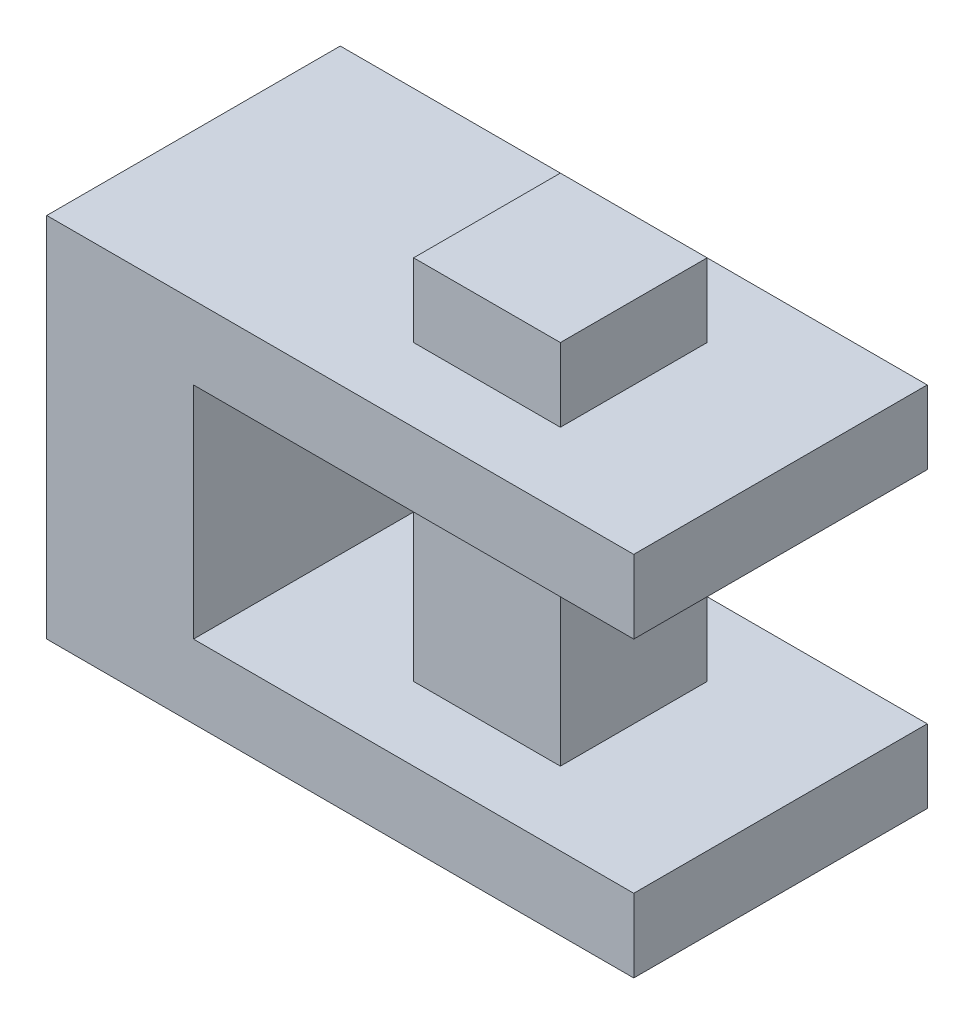
ISO-10303-21;
HEADER;
FILE_DESCRIPTION(('STEP AP214'),'2;1');
FILE_NAME('part.step','',(''),(''),'','','');
FILE_SCHEMA(('AUTOMOTIVE_DESIGN { 1 0 10303 214 1 1 1 1 }'));
ENDSEC;
DATA;
#1=APPLICATION_CONTEXT('core data for automotive mechanical design processes');
#2=APPLICATION_PROTOCOL_DEFINITION('international standard','automotive_design',2000,#1);
#3=PRODUCT_CONTEXT('',#1,'mechanical');
#4=PRODUCT('Part','Part','',(#3));
#5=PRODUCT_RELATED_PRODUCT_CATEGORY('part','',(#4));
#6=PRODUCT_DEFINITION_FORMATION('','',#4);
#7=PRODUCT_DEFINITION_CONTEXT('part definition',#1,'design');
#8=PRODUCT_DEFINITION('design','',#6,#7);
#9=PRODUCT_DEFINITION_SHAPE('','',#8);
#10=(LENGTH_UNIT() NAMED_UNIT(*) SI_UNIT(.MILLI.,.METRE.));
#11=(NAMED_UNIT(*) PLANE_ANGLE_UNIT() SI_UNIT($,.RADIAN.));
#12=(NAMED_UNIT(*) SI_UNIT($,.STERADIAN.) SOLID_ANGLE_UNIT());
#13=UNCERTAINTY_MEASURE_WITH_UNIT(LENGTH_MEASURE(1.E-05),#10,'distance_accuracy_value','');
#14=(GEOMETRIC_REPRESENTATION_CONTEXT(3) GLOBAL_UNCERTAINTY_ASSIGNED_CONTEXT((#13)) GLOBAL_UNIT_ASSIGNED_CONTEXT((#10,
#11,#12)) REPRESENTATION_CONTEXT('',''));
#15=CARTESIAN_POINT('',(0.,0.,0.));
#16=DIRECTION('',(0.,0.,1.));
#17=DIRECTION('',(1.,0.,0.));
#18=AXIS2_PLACEMENT_3D('',#15,#16,#17);
#19=CARTESIAN_POINT('',(0.,25.,20.));
#20=DIRECTION('',(1.,0.,0.));
#21=DIRECTION('',(0.,0.,-1.));
#22=AXIS2_PLACEMENT_3D('',#19,#20,#21);
#23=PLANE('',#22);
#24=DIRECTION('',(0.,-1.,0.));
#25=VECTOR('',#24,1.);
#26=CARTESIAN_POINT('',(0.,25.,0.));
#27=LINE('',#26,#25);
#28=CARTESIAN_POINT('',(0.,25.,0.));
#29=VERTEX_POINT('',#28);
#30=CARTESIAN_POINT('',(0.,0.,0.));
#31=VERTEX_POINT('',#30);
#32=EDGE_CURVE('E204',#29,#31,#27,.T.);
#33=ORIENTED_EDGE('',*,*,#32,.T.);
#34=DIRECTION('',(0.,0.,-1.));
#35=VECTOR('',#34,1.);
#36=CARTESIAN_POINT('',(0.,0.,20.));
#37=LINE('',#36,#35);
#38=CARTESIAN_POINT('',(0.,0.,20.));
#39=VERTEX_POINT('',#38);
#40=EDGE_CURVE('E259',#39,#31,#37,.T.);
#41=ORIENTED_EDGE('',*,*,#40,.F.);
#42=DIRECTION('',(0.,-1.,0.));
#43=VECTOR('',#42,1.);
#44=CARTESIAN_POINT('',(0.,25.,20.));
#45=LINE('',#44,#43);
#46=CARTESIAN_POINT('',(0.,25.,20.));
#47=VERTEX_POINT('',#46);
#48=EDGE_CURVE('E205',#47,#39,#45,.T.);
#49=ORIENTED_EDGE('',*,*,#48,.F.);
#50=DIRECTION('',(0.,0.,-1.));
#51=VECTOR('',#50,1.);
#52=CARTESIAN_POINT('',(0.,25.,20.));
#53=LINE('',#52,#51);
#54=EDGE_CURVE('E223',#47,#29,#53,.T.);
#55=ORIENTED_EDGE('',*,*,#54,.T.);
#56=EDGE_LOOP('',(#33,#41,#49,#55));
#57=FACE_BOUND('',#56,.T.);
#58=ADVANCED_FACE('F35',(#57),#23,.F.);
#59=CARTESIAN_POINT('',(0.,0.,20.));
#60=DIRECTION('',(0.,1.,0.));
#61=DIRECTION('',(0.,0.,1.));
#62=AXIS2_PLACEMENT_3D('',#59,#60,#61);
#63=PLANE('',#62);
#64=DIRECTION('',(1.,0.,0.));
#65=VECTOR('',#64,1.);
#66=CARTESIAN_POINT('',(0.,0.,0.));
#67=LINE('',#66,#65);
#68=CARTESIAN_POINT('',(40.,0.,0.));
#69=VERTEX_POINT('',#68);
#70=EDGE_CURVE('E226',#31,#69,#67,.T.);
#71=ORIENTED_EDGE('',*,*,#70,.T.);
#72=DIRECTION('',(0.,0.,-1.));
#73=VECTOR('',#72,1.);
#74=CARTESIAN_POINT('',(40.,0.,20.));
#75=LINE('',#74,#73);
#76=CARTESIAN_POINT('',(40.,0.,20.));
#77=VERTEX_POINT('',#76);
#78=EDGE_CURVE('E256',#77,#69,#75,.T.);
#79=ORIENTED_EDGE('',*,*,#78,.F.);
#80=DIRECTION('',(1.,0.,0.));
#81=VECTOR('',#80,1.);
#82=CARTESIAN_POINT('',(0.,0.,20.));
#83=LINE('',#82,#81);
#84=EDGE_CURVE('E208',#39,#77,#83,.T.);
#85=ORIENTED_EDGE('',*,*,#84,.F.);
#86=ORIENTED_EDGE('',*,*,#40,.T.);
#87=EDGE_LOOP('',(#71,#79,#85,#86));
#88=FACE_BOUND('',#87,.T.);
#89=ADVANCED_FACE('F289',(#88),#63,.F.);
#90=CARTESIAN_POINT('',(40.,0.,20.));
#91=DIRECTION('',(-1.,0.,0.));
#92=DIRECTION('',(0.,0.,1.));
#93=AXIS2_PLACEMENT_3D('',#90,#91,#92);
#94=PLANE('',#93);
#95=DIRECTION('',(0.,1.,0.));
#96=VECTOR('',#95,1.);
#97=CARTESIAN_POINT('',(40.,0.,0.));
#98=LINE('',#97,#96);
#99=CARTESIAN_POINT('',(40.,5.,0.));
#100=VERTEX_POINT('',#99);
#101=EDGE_CURVE('E228',#69,#100,#98,.T.);
#102=ORIENTED_EDGE('',*,*,#101,.T.);
#103=DIRECTION('',(0.,0.,-1.));
#104=VECTOR('',#103,1.);
#105=CARTESIAN_POINT('',(40.,5.,20.));
#106=LINE('',#105,#104);
#107=CARTESIAN_POINT('',(40.,5.,20.));
#108=VERTEX_POINT('',#107);
#109=EDGE_CURVE('E253',#108,#100,#106,.T.);
#110=ORIENTED_EDGE('',*,*,#109,.F.);
#111=DIRECTION('',(0.,1.,0.));
#112=VECTOR('',#111,1.);
#113=CARTESIAN_POINT('',(40.,0.,20.));
#114=LINE('',#113,#112);
#115=EDGE_CURVE('E211',#77,#108,#114,.T.);
#116=ORIENTED_EDGE('',*,*,#115,.F.);
#117=ORIENTED_EDGE('',*,*,#78,.T.);
#118=EDGE_LOOP('',(#102,#110,#116,#117));
#119=FACE_BOUND('',#118,.T.);
#120=ADVANCED_FACE('F294',(#119),#94,.F.);
#121=CARTESIAN_POINT('',(40.,5.,20.));
#122=DIRECTION('',(0.,-1.,0.));
#123=DIRECTION('',(0.,0.,-1.));
#124=AXIS2_PLACEMENT_3D('',#121,#122,#123);
#125=PLANE('',#124);
#126=DIRECTION('',(-1.,0.,0.));
#127=VECTOR('',#126,1.);
#128=CARTESIAN_POINT('',(40.,5.,15.));
#129=LINE('',#128,#127);
#130=CARTESIAN_POINT('',(30.,5.,15.));
#131=VERTEX_POINT('',#130);
#132=CARTESIAN_POINT('',(20.,5.,15.));
#133=VERTEX_POINT('',#132);
#134=EDGE_CURVE('E183',#131,#133,#129,.T.);
#135=ORIENTED_EDGE('',*,*,#134,.T.);
#136=DIRECTION('',(0.,0.,-1.));
#137=VECTOR('',#136,1.);
#138=CARTESIAN_POINT('',(20.,5.,20.));
#139=LINE('',#138,#137);
#140=CARTESIAN_POINT('',(20.,5.,5.));
#141=VERTEX_POINT('',#140);
#142=EDGE_CURVE('E201',#133,#141,#139,.T.);
#143=ORIENTED_EDGE('',*,*,#142,.T.);
#144=DIRECTION('',(1.,0.,0.));
#145=VECTOR('',#144,1.);
#146=CARTESIAN_POINT('',(40.,5.,5.));
#147=LINE('',#146,#145);
#148=CARTESIAN_POINT('',(30.,5.,5.));
#149=VERTEX_POINT('',#148);
#150=EDGE_CURVE('E195',#141,#149,#147,.T.);
#151=ORIENTED_EDGE('',*,*,#150,.T.);
#152=DIRECTION('',(0.,0.,1.));
#153=VECTOR('',#152,1.);
#154=CARTESIAN_POINT('',(30.,5.,20.));
#155=LINE('',#154,#153);
#156=EDGE_CURVE('E189',#149,#131,#155,.T.);
#157=ORIENTED_EDGE('',*,*,#156,.T.);
#158=EDGE_LOOP('',(#135,#143,#151,#157));
#159=FACE_BOUND('',#158,.T.);
#160=DIRECTION('',(-1.,0.,0.));
#161=VECTOR('',#160,1.);
#162=CARTESIAN_POINT('',(40.,5.,0.));
#163=LINE('',#162,#161);
#164=CARTESIAN_POINT('',(10.,5.,0.));
#165=VERTEX_POINT('',#164);
#166=EDGE_CURVE('E230',#100,#165,#163,.T.);
#167=ORIENTED_EDGE('',*,*,#166,.T.);
#168=DIRECTION('',(0.,0.,-1.));
#169=VECTOR('',#168,1.);
#170=CARTESIAN_POINT('',(10.,5.,20.));
#171=LINE('',#170,#169);
#172=CARTESIAN_POINT('',(10.,5.,20.));
#173=VERTEX_POINT('',#172);
#174=EDGE_CURVE('E250',#173,#165,#171,.T.);
#175=ORIENTED_EDGE('',*,*,#174,.F.);
#176=DIRECTION('',(-1.,0.,0.));
#177=VECTOR('',#176,1.);
#178=CARTESIAN_POINT('',(40.,5.,20.));
#179=LINE('',#178,#177);
#180=EDGE_CURVE('E213',#108,#173,#179,.T.);
#181=ORIENTED_EDGE('',*,*,#180,.F.);
#182=ORIENTED_EDGE('',*,*,#109,.T.);
#183=EDGE_LOOP('',(#167,#175,#181,#182));
#184=FACE_BOUND('',#183,.T.);
#185=ADVANCED_FACE('F328',(#159,#184),#125,.F.);
#186=CARTESIAN_POINT('',(10.,5.,20.));
#187=DIRECTION('',(-1.,0.,0.));
#188=DIRECTION('',(0.,0.,1.));
#189=AXIS2_PLACEMENT_3D('',#186,#187,#188);
#190=PLANE('',#189);
#191=DIRECTION('',(0.,1.,0.));
#192=VECTOR('',#191,1.);
#193=CARTESIAN_POINT('',(10.,5.,0.));
#194=LINE('',#193,#192);
#195=CARTESIAN_POINT('',(10.,20.,0.));
#196=VERTEX_POINT('',#195);
#197=EDGE_CURVE('E232',#165,#196,#194,.T.);
#198=ORIENTED_EDGE('',*,*,#197,.T.);
#199=DIRECTION('',(0.,0.,-1.));
#200=VECTOR('',#199,1.);
#201=CARTESIAN_POINT('',(10.,20.,20.));
#202=LINE('',#201,#200);
#203=CARTESIAN_POINT('',(10.,20.,20.));
#204=VERTEX_POINT('',#203);
#205=EDGE_CURVE('E247',#204,#196,#202,.T.);
#206=ORIENTED_EDGE('',*,*,#205,.F.);
#207=DIRECTION('',(0.,1.,0.));
#208=VECTOR('',#207,1.);
#209=CARTESIAN_POINT('',(10.,5.,20.));
#210=LINE('',#209,#208);
#211=EDGE_CURVE('E215',#173,#204,#210,.T.);
#212=ORIENTED_EDGE('',*,*,#211,.F.);
#213=ORIENTED_EDGE('',*,*,#174,.T.);
#214=EDGE_LOOP('',(#198,#206,#212,#213));
#215=FACE_BOUND('',#214,.T.);
#216=ADVANCED_FACE('F324',(#215),#190,.F.);
#217=CARTESIAN_POINT('',(10.,20.,20.));
#218=DIRECTION('',(0.,1.,0.));
#219=DIRECTION('',(0.,0.,1.));
#220=AXIS2_PLACEMENT_3D('',#217,#218,#219);
#221=PLANE('',#220);
#222=DIRECTION('',(-1.,0.,0.));
#223=VECTOR('',#222,1.);
#224=CARTESIAN_POINT('',(10.,20.,5.));
#225=LINE('',#224,#223);
#226=CARTESIAN_POINT('',(30.,20.,5.));
#227=VERTEX_POINT('',#226);
#228=CARTESIAN_POINT('',(20.,20.,5.));
#229=VERTEX_POINT('',#228);
#230=EDGE_CURVE('E192',#227,#229,#225,.T.);
#231=ORIENTED_EDGE('',*,*,#230,.T.);
#232=DIRECTION('',(0.,0.,1.));
#233=VECTOR('',#232,1.);
#234=CARTESIAN_POINT('',(20.,20.,20.));
#235=LINE('',#234,#233);
#236=CARTESIAN_POINT('',(20.,20.,15.));
#237=VERTEX_POINT('',#236);
#238=EDGE_CURVE('E198',#229,#237,#235,.T.);
#239=ORIENTED_EDGE('',*,*,#238,.T.);
#240=DIRECTION('',(1.,0.,0.));
#241=VECTOR('',#240,1.);
#242=CARTESIAN_POINT('',(10.,20.,15.));
#243=LINE('',#242,#241);
#244=CARTESIAN_POINT('',(30.,20.,15.));
#245=VERTEX_POINT('',#244);
#246=EDGE_CURVE('E180',#237,#245,#243,.T.);
#247=ORIENTED_EDGE('',*,*,#246,.T.);
#248=DIRECTION('',(0.,0.,-1.));
#249=VECTOR('',#248,1.);
#250=CARTESIAN_POINT('',(30.,20.,20.));
#251=LINE('',#250,#249);
#252=EDGE_CURVE('E186',#245,#227,#251,.T.);
#253=ORIENTED_EDGE('',*,*,#252,.T.);
#254=EDGE_LOOP('',(#231,#239,#247,#253));
#255=FACE_BOUND('',#254,.T.);
#256=DIRECTION('',(1.,0.,0.));
#257=VECTOR('',#256,1.);
#258=CARTESIAN_POINT('',(10.,20.,0.));
#259=LINE('',#258,#257);
#260=CARTESIAN_POINT('',(40.,20.,0.));
#261=VERTEX_POINT('',#260);
#262=EDGE_CURVE('E234',#196,#261,#259,.T.);
#263=ORIENTED_EDGE('',*,*,#262,.T.);
#264=DIRECTION('',(0.,0.,-1.));
#265=VECTOR('',#264,1.);
#266=CARTESIAN_POINT('',(40.,20.,20.));
#267=LINE('',#266,#265);
#268=CARTESIAN_POINT('',(40.,20.,20.));
#269=VERTEX_POINT('',#268);
#270=EDGE_CURVE('E244',#269,#261,#267,.T.);
#271=ORIENTED_EDGE('',*,*,#270,.F.);
#272=DIRECTION('',(1.,0.,0.));
#273=VECTOR('',#272,1.);
#274=CARTESIAN_POINT('',(10.,20.,20.));
#275=LINE('',#274,#273);
#276=EDGE_CURVE('E217',#204,#269,#275,.T.);
#277=ORIENTED_EDGE('',*,*,#276,.F.);
#278=ORIENTED_EDGE('',*,*,#205,.T.);
#279=EDGE_LOOP('',(#263,#271,#277,#278));
#280=FACE_BOUND('',#279,.T.);
#281=ADVANCED_FACE('F319',(#255,#280),#221,.F.);
#282=CARTESIAN_POINT('',(40.,20.,20.));
#283=DIRECTION('',(-1.,0.,0.));
#284=DIRECTION('',(0.,0.,1.));
#285=AXIS2_PLACEMENT_3D('',#282,#283,#284);
#286=PLANE('',#285);
#287=DIRECTION('',(0.,1.,0.));
#288=VECTOR('',#287,1.);
#289=CARTESIAN_POINT('',(40.,20.,0.));
#290=LINE('',#289,#288);
#291=CARTESIAN_POINT('',(40.,25.,0.));
#292=VERTEX_POINT('',#291);
#293=EDGE_CURVE('E236',#261,#292,#290,.T.);
#294=ORIENTED_EDGE('',*,*,#293,.T.);
#295=DIRECTION('',(0.,0.,-1.));
#296=VECTOR('',#295,1.);
#297=CARTESIAN_POINT('',(40.,25.,20.));
#298=LINE('',#297,#296);
#299=CARTESIAN_POINT('',(40.,25.,20.));
#300=VERTEX_POINT('',#299);
#301=EDGE_CURVE('E241',#300,#292,#298,.T.);
#302=ORIENTED_EDGE('',*,*,#301,.F.);
#303=DIRECTION('',(0.,1.,0.));
#304=VECTOR('',#303,1.);
#305=CARTESIAN_POINT('',(40.,20.,20.));
#306=LINE('',#305,#304);
#307=EDGE_CURVE('E219',#269,#300,#306,.T.);
#308=ORIENTED_EDGE('',*,*,#307,.F.);
#309=ORIENTED_EDGE('',*,*,#270,.T.);
#310=EDGE_LOOP('',(#294,#302,#308,#309));
#311=FACE_BOUND('',#310,.T.);
#312=ADVANCED_FACE('F314',(#311),#286,.F.);
#313=CARTESIAN_POINT('',(40.,25.,20.));
#314=DIRECTION('',(0.,-1.,0.));
#315=DIRECTION('',(0.,0.,-1.));
#316=AXIS2_PLACEMENT_3D('',#313,#314,#315);
#317=PLANE('',#316);
#318=DIRECTION('',(-1.,0.,0.));
#319=VECTOR('',#318,1.);
#320=CARTESIAN_POINT('',(40.,25.,15.));
#321=LINE('',#320,#319);
#322=CARTESIAN_POINT('',(30.,25.,15.));
#323=VERTEX_POINT('',#322);
#324=CARTESIAN_POINT('',(20.,25.,15.));
#325=VERTEX_POINT('',#324);
#326=EDGE_CURVE('E262',#323,#325,#321,.T.);
#327=ORIENTED_EDGE('',*,*,#326,.T.);
#328=DIRECTION('',(0.,0.,-1.));
#329=VECTOR('',#328,1.);
#330=CARTESIAN_POINT('',(20.,25.,20.));
#331=LINE('',#330,#329);
#332=CARTESIAN_POINT('',(20.,25.,5.));
#333=VERTEX_POINT('',#332);
#334=EDGE_CURVE('E11',#325,#333,#331,.T.);
#335=ORIENTED_EDGE('',*,*,#334,.T.);
#336=DIRECTION('',(1.,0.,0.));
#337=VECTOR('',#336,1.);
#338=CARTESIAN_POINT('',(40.,25.,5.));
#339=LINE('',#338,#337);
#340=CARTESIAN_POINT('',(30.,25.,5.));
#341=VERTEX_POINT('',#340);
#342=EDGE_CURVE('E42',#333,#341,#339,.T.);
#343=ORIENTED_EDGE('',*,*,#342,.T.);
#344=DIRECTION('',(0.,0.,1.));
#345=VECTOR('',#344,1.);
#346=CARTESIAN_POINT('',(30.,25.,20.));
#347=LINE('',#346,#345);
#348=EDGE_CURVE('E264',#341,#323,#347,.T.);
#349=ORIENTED_EDGE('',*,*,#348,.T.);
#350=EDGE_LOOP('',(#327,#335,#343,#349));
#351=FACE_BOUND('',#350,.T.);
#352=DIRECTION('',(-1.,0.,0.));
#353=VECTOR('',#352,1.);
#354=CARTESIAN_POINT('',(40.,25.,0.));
#355=LINE('',#354,#353);
#356=EDGE_CURVE('E209',#292,#29,#355,.T.);
#357=ORIENTED_EDGE('',*,*,#356,.T.);
#358=ORIENTED_EDGE('',*,*,#54,.F.);
#359=DIRECTION('',(-1.,0.,0.));
#360=VECTOR('',#359,1.);
#361=CARTESIAN_POINT('',(40.,25.,20.));
#362=LINE('',#361,#360);
#363=EDGE_CURVE('E221',#300,#47,#362,.T.);
#364=ORIENTED_EDGE('',*,*,#363,.F.);
#365=ORIENTED_EDGE('',*,*,#301,.T.);
#366=EDGE_LOOP('',(#357,#358,#364,#365));
#367=FACE_BOUND('',#366,.T.);
#368=ADVANCED_FACE('F268',(#351,#367),#317,.F.);
#369=CARTESIAN_POINT('',(0.,0.,20.));
#370=DIRECTION('',(0.,0.,1.));
#371=DIRECTION('',(1.,0.,0.));
#372=AXIS2_PLACEMENT_3D('',#369,#370,#371);
#373=PLANE('',#372);
#374=ORIENTED_EDGE('',*,*,#48,.T.);
#375=ORIENTED_EDGE('',*,*,#84,.T.);
#376=ORIENTED_EDGE('',*,*,#115,.T.);
#377=ORIENTED_EDGE('',*,*,#180,.T.);
#378=ORIENTED_EDGE('',*,*,#211,.T.);
#379=ORIENTED_EDGE('',*,*,#276,.T.);
#380=ORIENTED_EDGE('',*,*,#307,.T.);
#381=ORIENTED_EDGE('',*,*,#363,.T.);
#382=EDGE_LOOP('',(#374,#375,#376,#377,#378,#379,#380,#381));
#383=FACE_BOUND('',#382,.T.);
#384=ADVANCED_FACE('F309',(#383),#373,.T.);
#385=CARTESIAN_POINT('',(0.,0.,0.));
#386=DIRECTION('',(0.,0.,1.));
#387=DIRECTION('',(1.,0.,0.));
#388=AXIS2_PLACEMENT_3D('',#385,#386,#387);
#389=PLANE('',#388);
#390=ORIENTED_EDGE('',*,*,#32,.F.);
#391=ORIENTED_EDGE('',*,*,#356,.F.);
#392=ORIENTED_EDGE('',*,*,#293,.F.);
#393=ORIENTED_EDGE('',*,*,#262,.F.);
#394=ORIENTED_EDGE('',*,*,#197,.F.);
#395=ORIENTED_EDGE('',*,*,#166,.F.);
#396=ORIENTED_EDGE('',*,*,#101,.F.);
#397=ORIENTED_EDGE('',*,*,#70,.F.);
#398=EDGE_LOOP('',(#390,#391,#392,#393,#394,#395,#396,#397));
#399=FACE_BOUND('',#398,.T.);
#400=ADVANCED_FACE('F302',(#399),#389,.F.);
#401=CARTESIAN_POINT('',(0.,30.,0.));
#402=DIRECTION('',(0.,-1.,0.));
#403=DIRECTION('',(0.,0.,-1.));
#404=AXIS2_PLACEMENT_3D('',#401,#402,#403);
#405=PLANE('',#404);
#406=DIRECTION('',(0.,0.,1.));
#407=VECTOR('',#406,1.);
#408=CARTESIAN_POINT('',(20.,30.,15.));
#409=LINE('',#408,#407);
#410=CARTESIAN_POINT('',(20.,30.,5.));
#411=VERTEX_POINT('',#410);
#412=CARTESIAN_POINT('',(20.,30.,15.));
#413=VERTEX_POINT('',#412);
#414=EDGE_CURVE('E151',#411,#413,#409,.T.);
#415=ORIENTED_EDGE('',*,*,#414,.T.);
#416=DIRECTION('',(1.,0.,0.));
#417=VECTOR('',#416,1.);
#418=CARTESIAN_POINT('',(20.,30.,15.));
#419=LINE('',#418,#417);
#420=CARTESIAN_POINT('',(30.,30.,15.));
#421=VERTEX_POINT('',#420);
#422=EDGE_CURVE('E157',#413,#421,#419,.T.);
#423=ORIENTED_EDGE('',*,*,#422,.T.);
#424=DIRECTION('',(0.,0.,-1.));
#425=VECTOR('',#424,1.);
#426=CARTESIAN_POINT('',(30.,30.,15.));
#427=LINE('',#426,#425);
#428=CARTESIAN_POINT('',(30.,30.,5.));
#429=VERTEX_POINT('',#428);
#430=EDGE_CURVE('E164',#421,#429,#427,.T.);
#431=ORIENTED_EDGE('',*,*,#430,.T.);
#432=DIRECTION('',(-1.,0.,0.));
#433=VECTOR('',#432,1.);
#434=CARTESIAN_POINT('',(20.,30.,5.));
#435=LINE('',#434,#433);
#436=EDGE_CURVE('E154',#429,#411,#435,.T.);
#437=ORIENTED_EDGE('',*,*,#436,.T.);
#438=EDGE_LOOP('',(#415,#423,#431,#437));
#439=FACE_BOUND('',#438,.T.);
#440=ADVANCED_FACE('F167',(#439),#405,.F.);
#441=CARTESIAN_POINT('',(20.,0.,15.));
#442=DIRECTION('',(0.,0.,1.));
#443=DIRECTION('',(1.,0.,0.));
#444=AXIS2_PLACEMENT_3D('',#441,#442,#443);
#445=PLANE('',#444);
#446=ORIENTED_EDGE('',*,*,#326,.F.);
#447=DIRECTION('',(0.,1.,0.));
#448=VECTOR('',#447,1.);
#449=CARTESIAN_POINT('',(30.,0.,15.));
#450=LINE('',#449,#448);
#451=EDGE_CURVE('E160',#323,#421,#450,.T.);
#452=ORIENTED_EDGE('',*,*,#451,.T.);
#453=ORIENTED_EDGE('',*,*,#422,.F.);
#454=DIRECTION('',(0.,1.,0.));
#455=VECTOR('',#454,1.);
#456=CARTESIAN_POINT('',(20.,0.,15.));
#457=LINE('',#456,#455);
#458=EDGE_CURVE('E146',#325,#413,#457,.T.);
#459=ORIENTED_EDGE('',*,*,#458,.F.);
#460=EDGE_LOOP('',(#446,#452,#453,#459));
#461=FACE_BOUND('',#460,.T.);
#462=ADVANCED_FACE('F158',(#461),#445,.T.);
#463=CARTESIAN_POINT('',(30.,0.,15.));
#464=DIRECTION('',(1.,0.,0.));
#465=DIRECTION('',(0.,0.,-1.));
#466=AXIS2_PLACEMENT_3D('',#463,#464,#465);
#467=PLANE('',#466);
#468=ORIENTED_EDGE('',*,*,#348,.F.);
#469=DIRECTION('',(0.,1.,0.));
#470=VECTOR('',#469,1.);
#471=CARTESIAN_POINT('',(30.,0.,5.));
#472=LINE('',#471,#470);
#473=EDGE_CURVE('E177',#341,#429,#472,.T.);
#474=ORIENTED_EDGE('',*,*,#473,.T.);
#475=ORIENTED_EDGE('',*,*,#430,.F.);
#476=ORIENTED_EDGE('',*,*,#451,.F.);
#477=EDGE_LOOP('',(#468,#474,#475,#476));
#478=FACE_BOUND('',#477,.T.);
#479=ADVANCED_FACE('F274',(#478),#467,.T.);
#480=CARTESIAN_POINT('',(20.,0.,5.));
#481=DIRECTION('',(0.,0.,-1.));
#482=DIRECTION('',(-1.,0.,0.));
#483=AXIS2_PLACEMENT_3D('',#480,#481,#482);
#484=PLANE('',#483);
#485=ORIENTED_EDGE('',*,*,#342,.F.);
#486=DIRECTION('',(0.,1.,0.));
#487=VECTOR('',#486,1.);
#488=CARTESIAN_POINT('',(20.,0.,5.));
#489=LINE('',#488,#487);
#490=EDGE_CURVE('E173',#333,#411,#489,.T.);
#491=ORIENTED_EDGE('',*,*,#490,.T.);
#492=ORIENTED_EDGE('',*,*,#436,.F.);
#493=ORIENTED_EDGE('',*,*,#473,.F.);
#494=EDGE_LOOP('',(#485,#491,#492,#493));
#495=FACE_BOUND('',#494,.T.);
#496=ADVANCED_FACE('F272',(#495),#484,.T.);
#497=CARTESIAN_POINT('',(20.,0.,15.));
#498=DIRECTION('',(-1.,0.,0.));
#499=DIRECTION('',(0.,0.,1.));
#500=AXIS2_PLACEMENT_3D('',#497,#498,#499);
#501=PLANE('',#500);
#502=ORIENTED_EDGE('',*,*,#334,.F.);
#503=ORIENTED_EDGE('',*,*,#458,.T.);
#504=ORIENTED_EDGE('',*,*,#414,.F.);
#505=ORIENTED_EDGE('',*,*,#490,.F.);
#506=EDGE_LOOP('',(#502,#503,#504,#505));
#507=FACE_BOUND('',#506,.T.);
#508=ADVANCED_FACE('F148',(#507),#501,.T.);
#509=ORIENTED_EDGE('',*,*,#142,.F.);
#510=EDGE_CURVE('E49',#133,#237,#457,.T.);
#511=ORIENTED_EDGE('',*,*,#510,.T.);
#512=ORIENTED_EDGE('',*,*,#238,.F.);
#513=EDGE_CURVE('E175',#141,#229,#489,.T.);
#514=ORIENTED_EDGE('',*,*,#513,.F.);
#515=EDGE_LOOP('',(#509,#511,#512,#514));
#516=FACE_BOUND('',#515,.T.);
#517=ADVANCED_FACE('F352',(#516),#501,.T.);
#518=ORIENTED_EDGE('',*,*,#150,.F.);
#519=ORIENTED_EDGE('',*,*,#513,.T.);
#520=ORIENTED_EDGE('',*,*,#230,.F.);
#521=EDGE_CURVE('E176',#149,#227,#472,.T.);
#522=ORIENTED_EDGE('',*,*,#521,.F.);
#523=EDGE_LOOP('',(#518,#519,#520,#522));
#524=FACE_BOUND('',#523,.T.);
#525=ADVANCED_FACE('F283',(#524),#484,.T.);
#526=ORIENTED_EDGE('',*,*,#156,.F.);
#527=ORIENTED_EDGE('',*,*,#521,.T.);
#528=ORIENTED_EDGE('',*,*,#252,.F.);
#529=EDGE_CURVE('E54',#131,#245,#450,.T.);
#530=ORIENTED_EDGE('',*,*,#529,.F.);
#531=EDGE_LOOP('',(#526,#527,#528,#530));
#532=FACE_BOUND('',#531,.T.);
#533=ADVANCED_FACE('F277',(#532),#467,.T.);
#534=ORIENTED_EDGE('',*,*,#134,.F.);
#535=ORIENTED_EDGE('',*,*,#529,.T.);
#536=ORIENTED_EDGE('',*,*,#246,.F.);
#537=ORIENTED_EDGE('',*,*,#510,.F.);
#538=EDGE_LOOP('',(#534,#535,#536,#537));
#539=FACE_BOUND('',#538,.T.);
#540=ADVANCED_FACE('F285',(#539),#445,.T.);
#541=CLOSED_SHELL('',(#58,#89,#120,#185,#216,#281,#312,#368,#384,#400,#440,#462,#479,#496,#508,
#517,#525,#533,#540));
#542=MANIFOLD_SOLID_BREP('B2',#541);
#543=ADVANCED_BREP_SHAPE_REPRESENTATION('',(#18,#542),#14);
#544=SHAPE_DEFINITION_REPRESENTATION(#9,#543);
ENDSEC;
END-ISO-10303-21;
